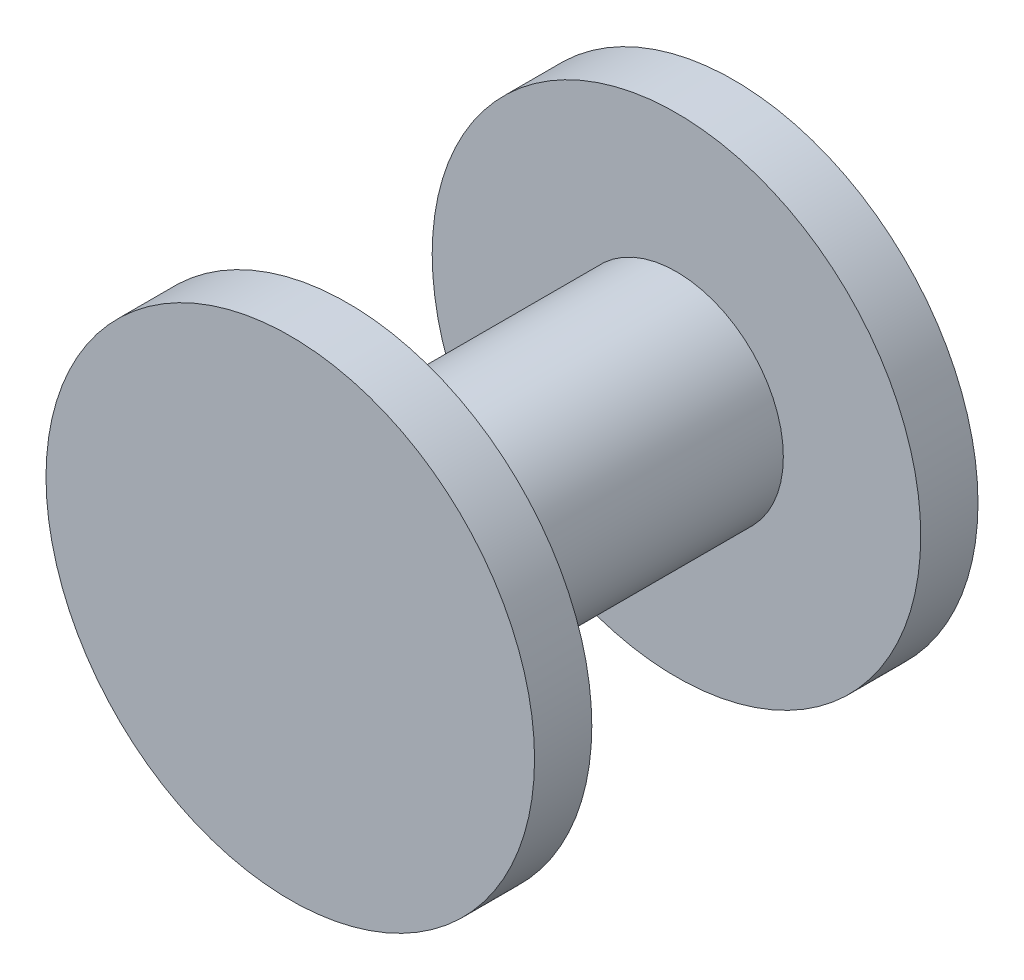
ISO-10303-21;
HEADER;
FILE_DESCRIPTION(('STEP AP214'),'2;1');
FILE_NAME('part.step','',(''),(''),'','','');
FILE_SCHEMA(('AUTOMOTIVE_DESIGN { 1 0 10303 214 1 1 1 1 }'));
ENDSEC;
DATA;
#1=APPLICATION_CONTEXT('core data for automotive mechanical design processes');
#2=APPLICATION_PROTOCOL_DEFINITION('international standard','automotive_design',2000,#1);
#3=PRODUCT_CONTEXT('',#1,'mechanical');
#4=PRODUCT('Part','Part','',(#3));
#5=PRODUCT_RELATED_PRODUCT_CATEGORY('part','',(#4));
#6=PRODUCT_DEFINITION_FORMATION('','',#4);
#7=PRODUCT_DEFINITION_CONTEXT('part definition',#1,'design');
#8=PRODUCT_DEFINITION('design','',#6,#7);
#9=PRODUCT_DEFINITION_SHAPE('','',#8);
#10=(LENGTH_UNIT() NAMED_UNIT(*) SI_UNIT(.MILLI.,.METRE.));
#11=(NAMED_UNIT(*) PLANE_ANGLE_UNIT() SI_UNIT($,.RADIAN.));
#12=(NAMED_UNIT(*) SI_UNIT($,.STERADIAN.) SOLID_ANGLE_UNIT());
#13=UNCERTAINTY_MEASURE_WITH_UNIT(LENGTH_MEASURE(1.E-05),#10,'distance_accuracy_value','');
#14=(GEOMETRIC_REPRESENTATION_CONTEXT(3) GLOBAL_UNCERTAINTY_ASSIGNED_CONTEXT((#13)) GLOBAL_UNIT_ASSIGNED_CONTEXT((#10,
#11,#12)) REPRESENTATION_CONTEXT('',''));
#15=CARTESIAN_POINT('',(0.,0.,0.));
#16=DIRECTION('',(0.,0.,1.));
#17=DIRECTION('',(1.,0.,0.));
#18=AXIS2_PLACEMENT_3D('',#15,#16,#17);
#19=CARTESIAN_POINT('',(-448.613448859326,-72.4648286001553,-36.8880599285931));
#20=DIRECTION('',(0.,0.,-1.));
#21=DIRECTION('',(-1.,0.,0.));
#22=AXIS2_PLACEMENT_3D('',#19,#20,#21);
#23=PLANE('',#22);
#24=CARTESIAN_POINT('',(-448.613448859326,-72.4648286001553,-36.8880599285932));
#25=DIRECTION('',(0.,0.,1.));
#26=DIRECTION('',(1.,0.,0.));
#27=AXIS2_PLACEMENT_3D('',#24,#25,#26);
#28=CIRCLE('',#27,40.6399999999999);
#29=CARTESIAN_POINT('',(-407.973448859326,-72.4648286001553,-36.888059928593));
#30=VERTEX_POINT('',#29);
#31=EDGE_CURVE('E18',#30,#30,#28,.T.);
#32=ORIENTED_EDGE('',*,*,#31,.F.);
#33=EDGE_LOOP('',(#32));
#34=FACE_BOUND('',#33,.T.);
#35=ADVANCED_FACE('F15',(#34),#23,.T.);
#36=CARTESIAN_POINT('',(-448.613448859326,-72.4648286001553,-27.3630599285931));
#37=DIRECTION('',(0.,0.,1.));
#38=DIRECTION('',(1.,0.,0.));
#39=AXIS2_PLACEMENT_3D('',#36,#37,#38);
#40=CYLINDRICAL_SURFACE('',#39,40.6399999999999);
#41=ORIENTED_EDGE('',*,*,#31,.T.);
#42=EDGE_LOOP('',(#41));
#43=FACE_BOUND('',#42,.T.);
#44=CARTESIAN_POINT('',(-448.613448859326,-72.4648286001553,-27.3630599285931));
#45=DIRECTION('',(0.,0.,1.));
#46=DIRECTION('',(1.,0.,0.));
#47=AXIS2_PLACEMENT_3D('',#44,#45,#46);
#48=CIRCLE('',#47,40.6399999999999);
#49=CARTESIAN_POINT('',(-407.973448859326,-72.4648286001553,-27.363059928593));
#50=VERTEX_POINT('',#49);
#51=EDGE_CURVE('E34',#50,#50,#48,.F.);
#52=ORIENTED_EDGE('',*,*,#51,.T.);
#53=EDGE_LOOP('',(#52));
#54=FACE_BOUND('',#53,.T.);
#55=ADVANCED_FACE('F41',(#43,#54),#40,.T.);
#56=CARTESIAN_POINT('',(-448.613448859326,-72.4648286001553,-27.3630599285931));
#57=DIRECTION('',(0.,0.,-1.));
#58=DIRECTION('',(-1.,0.,0.));
#59=AXIS2_PLACEMENT_3D('',#56,#57,#58);
#60=PLANE('',#59);
#61=CARTESIAN_POINT('',(-448.613448859326,-72.4648286001553,-27.3630599285932));
#62=DIRECTION('',(0.,0.,1.));
#63=DIRECTION('',(1.,0.,0.));
#64=AXIS2_PLACEMENT_3D('',#61,#62,#63);
#65=CIRCLE('',#64,17.78);
#66=CARTESIAN_POINT('',(-430.833448859326,-72.4648286001553,-27.3630599285932));
#67=VERTEX_POINT('',#66);
#68=EDGE_CURVE('E32',#67,#67,#65,.T.);
#69=ORIENTED_EDGE('',*,*,#68,.F.);
#70=EDGE_LOOP('',(#69));
#71=FACE_BOUND('',#70,.T.);
#72=ORIENTED_EDGE('',*,*,#51,.F.);
#73=EDGE_LOOP('',(#72));
#74=FACE_BOUND('',#73,.T.);
#75=ADVANCED_FACE('F48',(#71,#74),#60,.F.);
#76=CARTESIAN_POINT('',(-448.613448859326,-72.4648286001553,-27.3630599285932));
#77=DIRECTION('',(0.,0.,1.));
#78=DIRECTION('',(1.,0.,0.));
#79=AXIS2_PLACEMENT_3D('',#76,#77,#78);
#80=CYLINDRICAL_SURFACE('',#79,17.78);
#81=CARTESIAN_POINT('',(-448.613448859326,-72.4648286001553,27.3618067779083));
#82=DIRECTION('',(0.,0.,1.));
#83=DIRECTION('',(1.,0.,0.));
#84=AXIS2_PLACEMENT_3D('',#81,#82,#83);
#85=CIRCLE('',#84,17.78);
#86=CARTESIAN_POINT('',(-430.833448859326,-72.4648286001553,27.3618067779082));
#87=VERTEX_POINT('',#86);
#88=EDGE_CURVE('E27',#87,#87,#85,.F.);
#89=ORIENTED_EDGE('',*,*,#88,.T.);
#90=EDGE_LOOP('',(#89));
#91=FACE_BOUND('',#90,.T.);
#92=ORIENTED_EDGE('',*,*,#68,.T.);
#93=EDGE_LOOP('',(#92));
#94=FACE_BOUND('',#93,.T.);
#95=ADVANCED_FACE('F62',(#91,#94),#80,.T.);
#96=CARTESIAN_POINT('',(-448.613448859326,-72.4648286001553,27.3618067779082));
#97=DIRECTION('',(0.,0.,1.));
#98=DIRECTION('',(1.,0.,0.));
#99=AXIS2_PLACEMENT_3D('',#96,#97,#98);
#100=PLANE('',#99);
#101=ORIENTED_EDGE('',*,*,#88,.F.);
#102=EDGE_LOOP('',(#101));
#103=FACE_BOUND('',#102,.T.);
#104=CARTESIAN_POINT('',(-448.613448859326,-72.4648286001553,27.3618067779083));
#105=DIRECTION('',(0.,0.,1.));
#106=DIRECTION('',(1.,0.,0.));
#107=AXIS2_PLACEMENT_3D('',#104,#105,#106);
#108=CIRCLE('',#107,40.6399999999999);
#109=CARTESIAN_POINT('',(-407.973448859326,-72.4648286001553,27.3618067779082));
#110=VERTEX_POINT('',#109);
#111=EDGE_CURVE('E22',#110,#110,#108,.T.);
#112=ORIENTED_EDGE('',*,*,#111,.F.);
#113=EDGE_LOOP('',(#112));
#114=FACE_BOUND('',#113,.T.);
#115=ADVANCED_FACE('F56',(#103,#114),#100,.F.);
#116=CARTESIAN_POINT('',(-448.613448859326,-72.4648286001553,27.3618067779082));
#117=DIRECTION('',(0.,0.,1.));
#118=DIRECTION('',(1.,0.,0.));
#119=AXIS2_PLACEMENT_3D('',#116,#117,#118);
#120=CYLINDRICAL_SURFACE('',#119,40.6399999999999);
#121=ORIENTED_EDGE('',*,*,#111,.T.);
#122=EDGE_LOOP('',(#121));
#123=FACE_BOUND('',#122,.T.);
#124=CARTESIAN_POINT('',(-448.613448859326,-72.4648286001553,36.8868067779083));
#125=DIRECTION('',(0.,0.,1.));
#126=DIRECTION('',(1.,0.,0.));
#127=AXIS2_PLACEMENT_3D('',#124,#125,#126);
#128=CIRCLE('',#127,40.6399999999999);
#129=CARTESIAN_POINT('',(-407.973448859326,-72.4648286001553,36.8868067779082));
#130=VERTEX_POINT('',#129);
#131=EDGE_CURVE('E10',#130,#130,#128,.T.);
#132=ORIENTED_EDGE('',*,*,#131,.F.);
#133=EDGE_LOOP('',(#132));
#134=FACE_BOUND('',#133,.T.);
#135=ADVANCED_FACE('F51',(#123,#134),#120,.T.);
#136=CARTESIAN_POINT('',(-448.613448859326,-72.4648286001553,36.8868067779082));
#137=DIRECTION('',(0.,0.,1.));
#138=DIRECTION('',(1.,0.,0.));
#139=AXIS2_PLACEMENT_3D('',#136,#137,#138);
#140=PLANE('',#139);
#141=ORIENTED_EDGE('',*,*,#131,.T.);
#142=EDGE_LOOP('',(#141));
#143=FACE_BOUND('',#142,.T.);
#144=ADVANCED_FACE('F49',(#143),#140,.T.);
#145=CLOSED_SHELL('',(#35,#55,#75,#95,#115,#135,#144));
#146=MANIFOLD_SOLID_BREP('B1',#145);
#147=ADVANCED_BREP_SHAPE_REPRESENTATION('',(#18,#146),#14);
#148=SHAPE_DEFINITION_REPRESENTATION(#9,#147);
ENDSEC;
END-ISO-10303-21;
